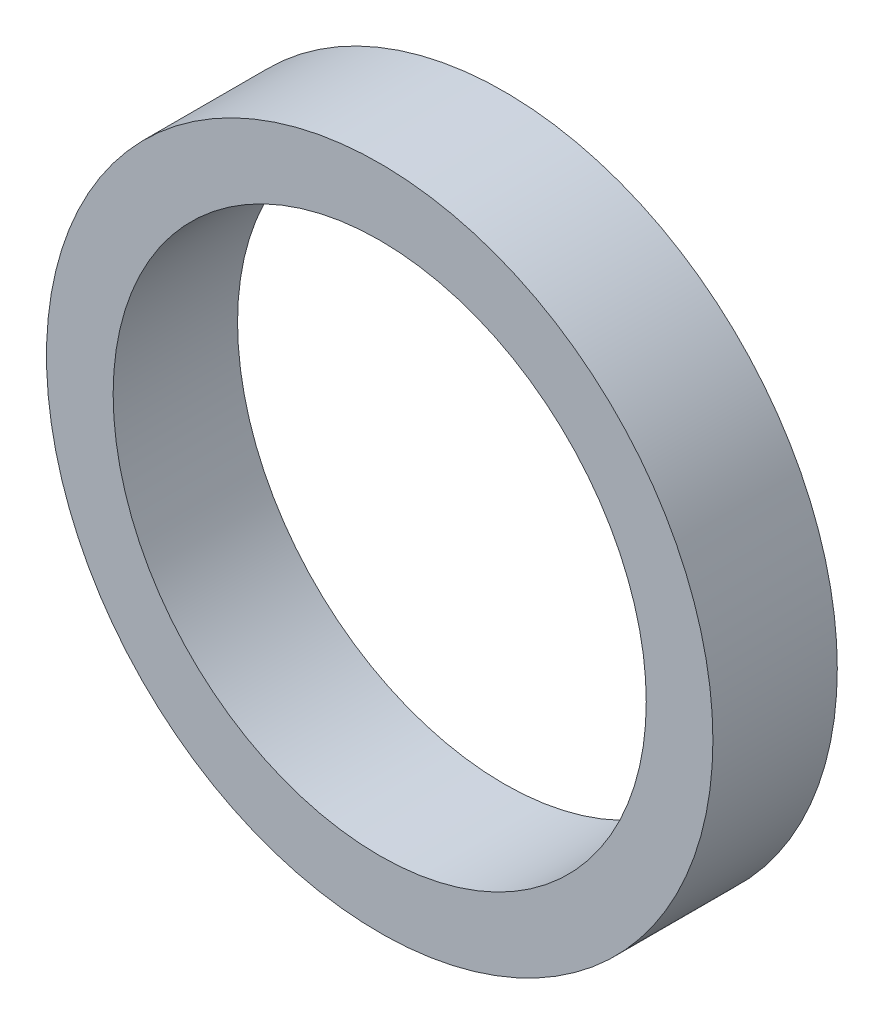
ISO-10303-21;
HEADER;
FILE_DESCRIPTION(('STEP AP214'),'2;1');
FILE_NAME('part.step','',(''),(''),'','','');
FILE_SCHEMA(('AUTOMOTIVE_DESIGN { 1 0 10303 214 1 1 1 1 }'));
ENDSEC;
DATA;
#1=APPLICATION_CONTEXT('core data for automotive mechanical design processes');
#2=APPLICATION_PROTOCOL_DEFINITION('international standard','automotive_design',2000,#1);
#3=PRODUCT_CONTEXT('',#1,'mechanical');
#4=PRODUCT('Part','Part','',(#3));
#5=PRODUCT_RELATED_PRODUCT_CATEGORY('part','',(#4));
#6=PRODUCT_DEFINITION_FORMATION('','',#4);
#7=PRODUCT_DEFINITION_CONTEXT('part definition',#1,'design');
#8=PRODUCT_DEFINITION('design','',#6,#7);
#9=PRODUCT_DEFINITION_SHAPE('','',#8);
#10=(LENGTH_UNIT() NAMED_UNIT(*) SI_UNIT(.MILLI.,.METRE.));
#11=(NAMED_UNIT(*) PLANE_ANGLE_UNIT() SI_UNIT($,.RADIAN.));
#12=(NAMED_UNIT(*) SI_UNIT($,.STERADIAN.) SOLID_ANGLE_UNIT());
#13=UNCERTAINTY_MEASURE_WITH_UNIT(LENGTH_MEASURE(1.E-05),#10,'distance_accuracy_value','');
#14=(GEOMETRIC_REPRESENTATION_CONTEXT(3) GLOBAL_UNCERTAINTY_ASSIGNED_CONTEXT((#13)) GLOBAL_UNIT_ASSIGNED_CONTEXT((#10,
#11,#12)) REPRESENTATION_CONTEXT('',''));
#15=CARTESIAN_POINT('',(0.,0.,0.));
#16=DIRECTION('',(0.,0.,1.));
#17=DIRECTION('',(1.,0.,0.));
#18=AXIS2_PLACEMENT_3D('',#15,#16,#17);
#19=CARTESIAN_POINT('',(0.,0.,1.39999999999998));
#20=DIRECTION('',(0.,0.,1.));
#21=DIRECTION('',(1.,0.,0.));
#22=AXIS2_PLACEMENT_3D('',#19,#20,#21);
#23=PLANE('',#22);
#24=CARTESIAN_POINT('',(0.,0.,1.39999999999998));
#25=DIRECTION('',(0.,0.,1.));
#26=DIRECTION('',(1.,0.,0.));
#27=AXIS2_PLACEMENT_3D('',#24,#25,#26);
#28=CIRCLE('',#27,7.5);
#29=CARTESIAN_POINT('',(7.49999999999994,0.,1.39999999999998));
#30=VERTEX_POINT('',#29);
#31=EDGE_CURVE('E10',#30,#30,#28,.T.);
#32=ORIENTED_EDGE('',*,*,#31,.T.);
#33=EDGE_LOOP('',(#32));
#34=FACE_BOUND('',#33,.T.);
#35=CARTESIAN_POINT('',(0.,0.,1.39999999999998));
#36=DIRECTION('',(0.,0.,1.));
#37=DIRECTION('',(1.,0.,0.));
#38=AXIS2_PLACEMENT_3D('',#35,#36,#37);
#39=CIRCLE('',#38,6.);
#40=CARTESIAN_POINT('',(5.99999999999995,0.,1.39999999999998));
#41=VERTEX_POINT('',#40);
#42=EDGE_CURVE('E39',#41,#41,#39,.T.);
#43=ORIENTED_EDGE('',*,*,#42,.F.);
#44=EDGE_LOOP('',(#43));
#45=FACE_BOUND('',#44,.T.);
#46=ADVANCED_FACE('F28',(#34,#45),#23,.T.);
#47=CARTESIAN_POINT('',(0.,0.,-1.40000000000001));
#48=DIRECTION('',(0.,0.,1.));
#49=DIRECTION('',(1.,0.,0.));
#50=AXIS2_PLACEMENT_3D('',#47,#48,#49);
#51=PLANE('',#50);
#52=CARTESIAN_POINT('',(0.,0.,-1.40000000000001));
#53=DIRECTION('',(0.,0.,1.));
#54=DIRECTION('',(1.,0.,0.));
#55=AXIS2_PLACEMENT_3D('',#52,#53,#54);
#56=CIRCLE('',#55,7.5);
#57=CARTESIAN_POINT('',(7.49999999999994,0.,-1.40000000000001));
#58=VERTEX_POINT('',#57);
#59=EDGE_CURVE('E35',#58,#58,#56,.T.);
#60=ORIENTED_EDGE('',*,*,#59,.F.);
#61=EDGE_LOOP('',(#60));
#62=FACE_BOUND('',#61,.T.);
#63=CARTESIAN_POINT('',(0.,0.,-1.40000000000001));
#64=DIRECTION('',(0.,0.,1.));
#65=DIRECTION('',(1.,0.,0.));
#66=AXIS2_PLACEMENT_3D('',#63,#64,#65);
#67=CIRCLE('',#66,6.);
#68=CARTESIAN_POINT('',(5.99999999999995,0.,-1.40000000000001));
#69=VERTEX_POINT('',#68);
#70=EDGE_CURVE('E43',#69,#69,#67,.T.);
#71=ORIENTED_EDGE('',*,*,#70,.T.);
#72=EDGE_LOOP('',(#71));
#73=FACE_BOUND('',#72,.T.);
#74=ADVANCED_FACE('F49',(#62,#73),#51,.F.);
#75=CARTESIAN_POINT('',(0.,0.,1.39999999999998));
#76=DIRECTION('',(0.,0.,-1.));
#77=DIRECTION('',(-1.,0.,0.));
#78=AXIS2_PLACEMENT_3D('',#75,#76,#77);
#79=CYLINDRICAL_SURFACE('',#78,7.5);
#80=ORIENTED_EDGE('',*,*,#31,.F.);
#81=EDGE_LOOP('',(#80));
#82=FACE_BOUND('',#81,.T.);
#83=ORIENTED_EDGE('',*,*,#59,.T.);
#84=EDGE_LOOP('',(#83));
#85=FACE_BOUND('',#84,.T.);
#86=ADVANCED_FACE('F30',(#82,#85),#79,.T.);
#87=CARTESIAN_POINT('',(0.,0.,1.39999999999998));
#88=DIRECTION('',(0.,0.,-1.));
#89=DIRECTION('',(-1.,0.,0.));
#90=AXIS2_PLACEMENT_3D('',#87,#88,#89);
#91=CYLINDRICAL_SURFACE('',#90,6.);
#92=ORIENTED_EDGE('',*,*,#42,.T.);
#93=EDGE_LOOP('',(#92));
#94=FACE_BOUND('',#93,.T.);
#95=ORIENTED_EDGE('',*,*,#70,.F.);
#96=EDGE_LOOP('',(#95));
#97=FACE_BOUND('',#96,.T.);
#98=ADVANCED_FACE('F51',(#94,#97),#91,.F.);
#99=CLOSED_SHELL('',(#46,#74,#86,#98));
#100=MANIFOLD_SOLID_BREP('B2',#99);
#101=ADVANCED_BREP_SHAPE_REPRESENTATION('',(#18,#100),#14);
#102=SHAPE_DEFINITION_REPRESENTATION(#9,#101);
ENDSEC;
END-ISO-10303-21;
